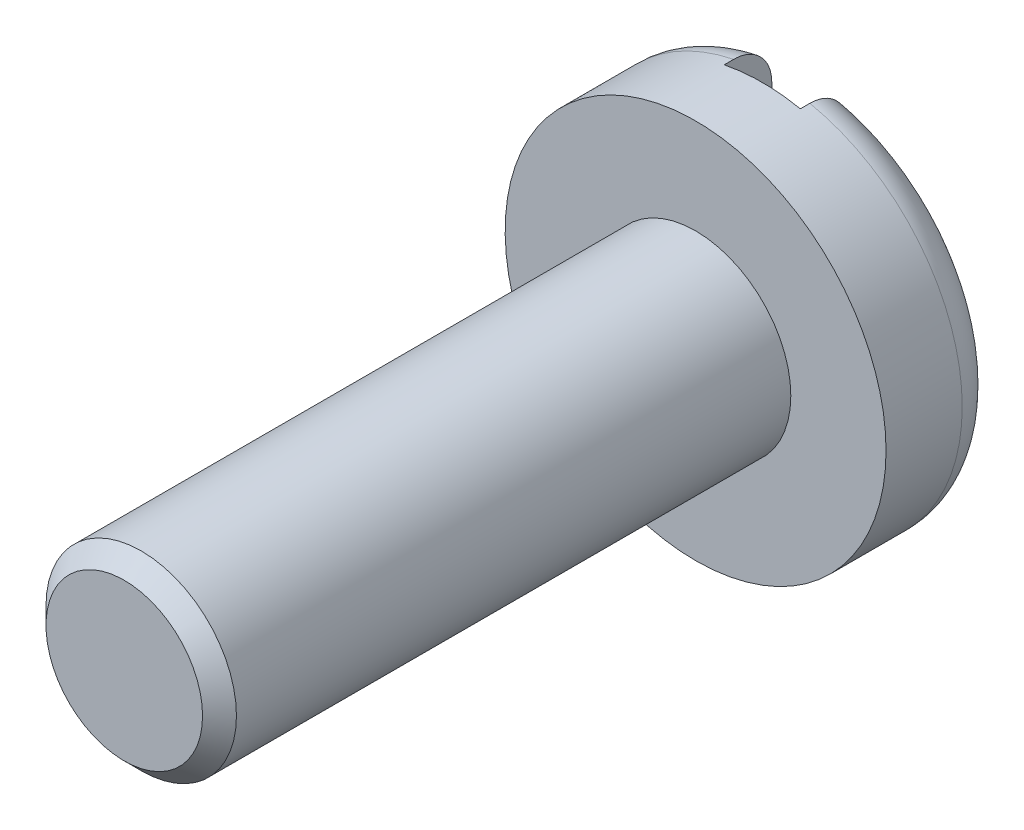
ISO-10303-21;
HEADER;
FILE_DESCRIPTION(('STEP AP214'),'2;1');
FILE_NAME('part.step','',(''),(''),'','','');
FILE_SCHEMA(('AUTOMOTIVE_DESIGN { 1 0 10303 214 1 1 1 1 }'));
ENDSEC;
DATA;
#1=APPLICATION_CONTEXT('core data for automotive mechanical design processes');
#2=APPLICATION_PROTOCOL_DEFINITION('international standard','automotive_design',2000,#1);
#3=PRODUCT_CONTEXT('',#1,'mechanical');
#4=PRODUCT('Part','Part','',(#3));
#5=PRODUCT_RELATED_PRODUCT_CATEGORY('part','',(#4));
#6=PRODUCT_DEFINITION_FORMATION('','',#4);
#7=PRODUCT_DEFINITION_CONTEXT('part definition',#1,'design');
#8=PRODUCT_DEFINITION('design','',#6,#7);
#9=PRODUCT_DEFINITION_SHAPE('','',#8);
#10=(LENGTH_UNIT() NAMED_UNIT(*) SI_UNIT(.MILLI.,.METRE.));
#11=(NAMED_UNIT(*) PLANE_ANGLE_UNIT() SI_UNIT($,.RADIAN.));
#12=(NAMED_UNIT(*) SI_UNIT($,.STERADIAN.) SOLID_ANGLE_UNIT());
#13=UNCERTAINTY_MEASURE_WITH_UNIT(LENGTH_MEASURE(1.E-05),#10,'distance_accuracy_value','');
#14=(GEOMETRIC_REPRESENTATION_CONTEXT(3) GLOBAL_UNCERTAINTY_ASSIGNED_CONTEXT((#13)) GLOBAL_UNIT_ASSIGNED_CONTEXT((#10,
#11,#12)) REPRESENTATION_CONTEXT('',''));
#15=CARTESIAN_POINT('',(0.,0.,0.));
#16=DIRECTION('',(0.,0.,1.));
#17=DIRECTION('',(1.,0.,0.));
#18=AXIS2_PLACEMENT_3D('',#15,#16,#17);
#19=CARTESIAN_POINT('',(0.,0.,0.));
#20=DIRECTION('',(0.,0.,1.));
#21=DIRECTION('',(1.,0.,0.));
#22=AXIS2_PLACEMENT_3D('',#19,#20,#21);
#23=PLANE('',#22);
#24=CARTESIAN_POINT('',(0.,0.,0.));
#25=DIRECTION('',(0.,0.,1.));
#26=DIRECTION('',(1.,0.,0.));
#27=AXIS2_PLACEMENT_3D('',#24,#25,#26);
#28=CIRCLE('',#27,4.);
#29=CARTESIAN_POINT('',(0.999999999999999,3.87298334620742,0.));
#30=VERTEX_POINT('',#29);
#31=CARTESIAN_POINT('',(0.999999999999999,-3.87298334620742,0.));
#32=VERTEX_POINT('',#31);
#33=EDGE_CURVE('E145',#30,#32,#28,.F.);
#34=ORIENTED_EDGE('',*,*,#33,.T.);
#35=DIRECTION('',(0.,1.,0.));
#36=VECTOR('',#35,1.);
#37=CARTESIAN_POINT('',(0.999999999999999,0.,0.));
#38=LINE('',#37,#36);
#39=EDGE_CURVE('E125',#32,#30,#38,.T.);
#40=ORIENTED_EDGE('',*,*,#39,.T.);
#41=EDGE_LOOP('',(#34,#40));
#42=FACE_BOUND('',#41,.T.);
#43=ADVANCED_FACE('F48',(#42),#23,.F.);
#44=CARTESIAN_POINT('',(0.,0.,1.));
#45=DIRECTION('',(0.,0.,1.));
#46=DIRECTION('',(1.,0.,0.));
#47=AXIS2_PLACEMENT_3D('',#44,#45,#46);
#48=TOROIDAL_SURFACE('',#47,4.,1.);
#49=CARTESIAN_POINT('',(0.999999999999999,-4.74089824241527,0.465574839603772));
#50=CARTESIAN_POINT('',(0.999999999999999,-4.77093906909583,0.51206702701001));
#51=CARTESIAN_POINT('',(0.999999999999999,-4.79711067903708,0.561102678447099));
#52=CARTESIAN_POINT('',(0.999999999999999,-4.84088596369063,0.662903994052508));
#53=CARTESIAN_POINT('',(0.999999999999999,-4.85848090806454,0.715673396580716));
#54=CARTESIAN_POINT('',(0.999999999999999,-4.88452978672489,0.823425083640973));
#55=CARTESIAN_POINT('',(0.999999999999999,-4.89298429664504,0.878407228595754));
#56=CARTESIAN_POINT('',(0.999999999999999,-4.90048364927595,0.988997037272202));
#57=CARTESIAN_POINT('',(0.999999999999999,-4.89953057800942,1.04460455959217));
#58=CARTESIAN_POINT('',(0.999999999999999,-4.8882807868657,1.15457059010988));
#59=CARTESIAN_POINT('',(0.999999999999999,-4.87803296373552,1.20893410986675));
#60=CARTESIAN_POINT('',(0.999999999999999,-4.84857983220366,1.31517705937444));
#61=CARTESIAN_POINT('',(0.999999999999999,-4.82937429620127,1.36705642597011));
#62=CARTESIAN_POINT('',(0.999999999999999,-4.78252772145242,1.46703140391835));
#63=CARTESIAN_POINT('',(0.999999999999999,-4.75486299230309,1.51511590558171));
#64=CARTESIAN_POINT('',(0.999999999999999,-4.69195239006159,1.60603553891727));
#65=CARTESIAN_POINT('',(0.999999999999999,-4.65670616379822,1.64887042589909));
#66=CARTESIAN_POINT('',(0.999999999999999,-4.57915929563324,1.72869929202435));
#67=CARTESIAN_POINT('',(0.999999999999999,-4.53677184786283,1.76560890237427));
#68=CARTESIAN_POINT('',(0.999999999999999,-4.44651378239344,1.83196438442698));
#69=CARTESIAN_POINT('',(0.999999999999999,-4.39864266087568,1.86140956952736));
#70=CARTESIAN_POINT('',(0.999999999999999,-4.29768563805518,1.912690559155));
#71=CARTESIAN_POINT('',(0.999999999999999,-4.24450972565911,1.93434908978383));
#72=CARTESIAN_POINT('',(0.999999999999999,-4.13533439460451,1.9686802440512));
#73=CARTESIAN_POINT('',(0.999999999999999,-4.07933461458573,1.98135171450631));
#74=CARTESIAN_POINT('',(0.999999999999999,-3.96457125808458,1.99768568641191));
#75=CARTESIAN_POINT('',(0.999999999999999,-3.90577363084606,2.00110903084919));
#76=CARTESIAN_POINT('',(0.999999999999999,-3.7884126545839,1.99826272601387));
#77=CARTESIAN_POINT('',(0.999999999999999,-3.72984933879538,1.99199174736522));
#78=CARTESIAN_POINT('',(0.999999999999999,-3.613268213964,1.96973618215348));
#79=CARTESIAN_POINT('',(0.999999999999999,-3.55529023657486,1.95354249044896));
#80=CARTESIAN_POINT('',(0.999999999999999,-3.44284084653008,1.91171023463247));
#81=CARTESIAN_POINT('',(0.999999999999999,-3.3883697828002,1.88607073239592));
#82=CARTESIAN_POINT('',(0.999999999999999,-3.28422225313787,1.82582762001542));
#83=CARTESIAN_POINT('',(0.999999999999999,-3.23457377181124,1.79117553669055));
#84=CARTESIAN_POINT('',(0.999999999999999,-3.14196876384408,1.713842252289));
#85=CARTESIAN_POINT('',(0.999999999999999,-3.09901174044189,1.67116164775493));
#86=CARTESIAN_POINT('',(0.999999999999999,-3.02220775407859,1.57998462898422));
#87=CARTESIAN_POINT('',(0.999999999999999,-2.98816883517039,1.5316502178449));
#88=CARTESIAN_POINT('',(0.999999999999999,-2.92919030253011,1.42971369977196));
#89=CARTESIAN_POINT('',(0.999999999999999,-2.90424742518487,1.37611349095908));
#90=CARTESIAN_POINT('',(0.999999999999999,-2.86551921866192,1.26804050353771));
#91=CARTESIAN_POINT('',(0.999999999999999,-2.85123849388488,1.21374526430384));
#92=CARTESIAN_POINT('',(0.999999999999999,-2.83246484792931,1.10349241104978));
#93=CARTESIAN_POINT('',(0.999999999999999,-2.82796880646208,1.04753533275381));
#94=CARTESIAN_POINT('',(0.999999999999999,-2.82893812506757,0.938164760828636));
#95=CARTESIAN_POINT('',(0.999999999999999,-2.83397680054707,0.884746962771905));
#96=CARTESIAN_POINT('',(0.999999999999999,-2.85296958556056,0.779526155630884));
#97=CARTESIAN_POINT('',(0.999999999999999,-2.86692347355491,0.727723106454245));
#98=CARTESIAN_POINT('',(0.999999999999999,-2.90317707406975,0.62720283956641));
#99=CARTESIAN_POINT('',(0.999999999999999,-2.92546742088583,0.578482230394738));
#100=CARTESIAN_POINT('',(0.999999999999999,-2.97760125095634,0.48527139927532));
#101=CARTESIAN_POINT('',(0.999999999999999,-3.00744601755024,0.440781897873544));
#102=CARTESIAN_POINT('',(0.999999999999999,-3.07509259167329,0.355344003704822));
#103=CARTESIAN_POINT('',(0.999999999999999,-3.11316807971552,0.314612481499972));
#104=CARTESIAN_POINT('',(0.999999999999999,-3.19532329186127,0.239740162341416));
#105=CARTESIAN_POINT('',(0.999999999999999,-3.2394044723506,0.20560096890261));
#106=CARTESIAN_POINT('',(0.999999999999999,-3.33470723090834,0.14311767029961));
#107=CARTESIAN_POINT('',(0.999999999999999,-3.38617614939443,0.115150438677534));
#108=CARTESIAN_POINT('',(0.999999999999999,-3.49297945352584,0.067959175273789));
#109=CARTESIAN_POINT('',(0.999999999999999,-3.54831453265273,0.0487367167295342));
#110=CARTESIAN_POINT('',(0.999999999999999,-3.66307362701856,0.0190822643418154));
#111=CARTESIAN_POINT('',(0.999999999999999,-3.72257051102004,0.00893131376428614));
#112=CARTESIAN_POINT('',(0.999999999999999,-3.84242579673291,-0.00125217946359011));
#113=CARTESIAN_POINT('',(0.999999999999999,-3.9027841982355,-0.00128472456621288));
#114=CARTESIAN_POINT('',(0.999999999999999,-4.02269182420806,0.00886219487331795));
#115=CARTESIAN_POINT('',(0.999999999999999,-4.08224035665226,0.0190498972791512));
#116=CARTESIAN_POINT('',(0.999999999999999,-4.19873146910034,0.0494817630717065));
#117=CARTESIAN_POINT('',(0.999999999999999,-4.2556736198033,0.06972757668119));
#118=CARTESIAN_POINT('',(0.999999999999999,-4.36414281303408,0.119321779303109));
#119=CARTESIAN_POINT('',(0.999999999999999,-4.41575180574797,0.148491064083182));
#120=CARTESIAN_POINT('',(0.999999999999999,-4.51311238926742,0.215283374984294));
#121=CARTESIAN_POINT('',(0.999999999999999,-4.55887194720193,0.252894705974579));
#122=CARTESIAN_POINT('',(0.999999999999999,-4.62736160475528,0.320058094017716));
#123=CARTESIAN_POINT('',(0.999999999999999,-4.65231431127167,0.347381814065032));
#124=CARTESIAN_POINT('',(0.999999999999999,-4.69905249332747,0.404617283436022));
#125=CARTESIAN_POINT('',(0.999999999999999,-4.72083802931435,0.43452898334908));
#126=CARTESIAN_POINT('',(0.999999999999999,-4.74089824241527,0.465574839603772));
#127=B_SPLINE_CURVE_WITH_KNOTS('',3,(#49,#50,#51,#52,#53,#54,#55,#56,#57,#58,#59,#60,#61,#62,
#63,#64,#65,#66,#67,#68,#69,#70,#71,#72,#73,#74,#75,#76,#77,#78,#79,#80,#81,#82,#83,#84,#85,#86,
#87,#88,#89,#90,#91,#92,#93,#94,#95,#96,#97,#98,#99,#100,#101,#102,#103,#104,#105,#106,#107,
#108,#109,#110,#111,#112,#113,#114,#115,#116,#117,#118,#119,#120,#121,#122,#123,#124,#125,#126),
.UNSPECIFIED.,.T.,.F.,(4,2,2,2,2,2,2,2,2,2,2,2,2,2,2,2,2,2,2,2,2,2,2,2,2,2,2,2,2,2,2,2,2,2,2,2,
2,2,4),(0.,0.165926564922769,0.332021678524293,0.498106331406758,0.664154157758893,
0.82933349370127,0.99451702680665,1.16016746881096,1.32582562903247,1.49366584887353,
1.66152150161308,1.83298720789472,2.00447491198791,2.18035666144788,2.35626253159434,
2.53600927491765,2.71577387486801,2.89652606583042,3.07726483167773,3.25371559012487,
3.43010297650855,3.59767353069205,3.76519063959225,3.92538799679189,4.08558137330303,
4.24559531645792,4.4056364609326,4.57217005850703,4.73874411274949,4.91367888365498,
5.08864511394687,5.26886084338837,5.44907652915315,5.62943759163489,5.80982825552668,
5.98681257878127,6.16355321494239,6.27435528518346,6.38515524041929),.UNSPECIFIED.);
#128=CARTESIAN_POINT('',(0.999999999999999,-4.89897948556991,1.00000000000064));
#129=VERTEX_POINT('',#128);
#130=EDGE_CURVE('E71',#32,#129,#127,.T.);
#131=ORIENTED_EDGE('',*,*,#130,.F.);
#132=ORIENTED_EDGE('',*,*,#33,.F.);
#133=CARTESIAN_POINT('',(0.999999999999999,2.93448378201662,0.563712357526974));
#134=CARTESIAN_POINT('',(0.999999999999999,2.91000701437085,0.611499699521355));
#135=CARTESIAN_POINT('',(0.999999999999999,2.88943587962965,0.6613192730997));
#136=CARTESIAN_POINT('',(0.999999999999999,2.85688814196943,0.763723114899403));
#137=CARTESIAN_POINT('',(0.999999999999999,2.84491671737472,0.816309028458516));
#138=CARTESIAN_POINT('',(0.999999999999999,2.83006066246026,0.922795059019514));
#139=CARTESIAN_POINT('',(0.999999999999999,2.8271824011816,0.976696070526368));
#140=CARTESIAN_POINT('',(0.999999999999999,2.83065505942636,1.08418986718175));
#141=CARTESIAN_POINT('',(0.999999999999999,2.83700451025153,1.13778270001759));
#142=CARTESIAN_POINT('',(0.999999999999999,2.85852543868406,1.24245417700771));
#143=CARTESIAN_POINT('',(0.999999999999999,2.8735849842021,1.29355596125553));
#144=CARTESIAN_POINT('',(0.999999999999999,2.91186043406805,1.39260230094927));
#145=CARTESIAN_POINT('',(0.999999999999999,2.9350773879355,1.44054644919567));
#146=CARTESIAN_POINT('',(0.999999999999999,2.98954837233285,1.53327223532849));
#147=CARTESIAN_POINT('',(0.999999999999999,3.02099187004184,1.57794236544402));
#148=CARTESIAN_POINT('',(0.999999999999999,3.09059404945473,1.66169746070875));
#149=CARTESIAN_POINT('',(0.999999999999999,3.12875423522928,1.70078117132914));
#150=CARTESIAN_POINT('',(0.999999999999999,3.21277099287321,1.77433657186925));
#151=CARTESIAN_POINT('',(0.999999999999999,3.2589190193294,1.80847544727498));
#152=CARTESIAN_POINT('',(0.999999999999999,3.35610501682304,1.86888755559914));
#153=CARTESIAN_POINT('',(0.999999999999999,3.40714406002746,1.89515905866895));
#154=CARTESIAN_POINT('',(0.999999999999999,3.51493663860159,1.94014213110062));
#155=CARTESIAN_POINT('',(0.999999999999999,3.57183891728481,1.95849801050286));
#156=CARTESIAN_POINT('',(0.999999999999999,3.68790012564205,1.98553945172235));
#157=CARTESIAN_POINT('',(0.999999999999999,3.74705928539265,1.9942240248639));
#158=CARTESIAN_POINT('',(0.999999999999999,3.86678683058724,2.00168514622703));
#159=CARTESIAN_POINT('',(0.999999999999999,3.92736351989617,2.00033007593359));
#160=CARTESIAN_POINT('',(0.999999999999999,4.04740864296231,1.98733987818855));
#161=CARTESIAN_POINT('',(0.999999999999999,4.1068771216297,1.97570516824781));
#162=CARTESIAN_POINT('',(0.999999999999999,4.22221655126588,1.94257877793046));
#163=CARTESIAN_POINT('',(0.999999999999999,4.27812271037955,1.92120988736992));
#164=CARTESIAN_POINT('',(0.999999999999999,4.38541897852354,1.86915599333329));
#165=CARTESIAN_POINT('',(0.999999999999999,4.4368096636758,1.83847218056493));
#166=CARTESIAN_POINT('',(0.999999999999999,4.53224912640572,1.76946640841065));
#167=CARTESIAN_POINT('',(0.999999999999999,4.57644808583963,1.73135219282969));
#168=CARTESIAN_POINT('',(0.999999999999999,4.65761246935788,1.64807163286058));
#169=CARTESIAN_POINT('',(0.999999999999999,4.6945789373752,1.60290630791939));
#170=CARTESIAN_POINT('',(0.999999999999999,4.75925187875461,1.50803971995027));
#171=CARTESIAN_POINT('',(0.999999999999999,4.78716840035085,1.45848160238852));
#172=CARTESIAN_POINT('',(0.999999999999999,4.83410331130973,1.35531690108024));
#173=CARTESIAN_POINT('',(0.999999999999999,4.85312271695606,1.30171078053451));
#174=CARTESIAN_POINT('',(0.999999999999999,4.8813849843533,1.19304353133181));
#175=CARTESIAN_POINT('',(0.999999999999999,4.89080246246899,1.13802776548886));
#176=CARTESIAN_POINT('',(0.999999999999999,4.90017893436993,1.02719713356779));
#177=CARTESIAN_POINT('',(0.999999999999999,4.90013853070775,0.971382318622866));
#178=CARTESIAN_POINT('',(0.999999999999999,4.89064282976504,0.861044631943875));
#179=CARTESIAN_POINT('',(0.999999999999999,4.88126827618146,0.806514785610181));
#180=CARTESIAN_POINT('',(0.999999999999999,4.85351703323853,0.699798298175667));
#181=CARTESIAN_POINT('',(0.999999999999999,4.83514041102996,0.647611639599051));
#182=CARTESIAN_POINT('',(0.999999999999999,4.7898963484848,0.546916340672522));
#183=CARTESIAN_POINT('',(0.999999999999999,4.76300931062551,0.49841651315801));
#184=CARTESIAN_POINT('',(0.999999999999999,4.70157102231077,0.40654588758618));
#185=CARTESIAN_POINT('',(0.999999999999999,4.66701943196387,0.363175317121159));
#186=CARTESIAN_POINT('',(0.999999999999999,4.59078648763996,0.28218375551089));
#187=CARTESIAN_POINT('',(0.999999999999999,4.54902009139599,0.244642852795113));
#188=CARTESIAN_POINT('',(0.999999999999999,4.45989016824042,0.176933955502939));
#189=CARTESIAN_POINT('',(0.999999999999999,4.41252611929278,0.146766649393012));
#190=CARTESIAN_POINT('',(0.999999999999999,4.31248365666993,0.0939644367849335));
#191=CARTESIAN_POINT('',(0.999999999999999,4.25971392738017,0.0715026113786261));
#192=CARTESIAN_POINT('',(0.999999999999999,4.15121403498489,0.0355099340098975));
#193=CARTESIAN_POINT('',(0.999999999999999,4.09548349400933,0.0219802249708486));
#194=CARTESIAN_POINT('',(0.999999999999999,3.98112357390738,0.00387475366064818));
#195=CARTESIAN_POINT('',(0.999999999999999,3.92245650859443,-0.00046302607484398));
#196=CARTESIAN_POINT('',(0.999999999999999,3.80520680768677,0.000541534748304016));
#197=CARTESIAN_POINT('',(0.999999999999999,3.74662418118805,0.0058848500380907));
#198=CARTESIAN_POINT('',(0.999999999999999,3.62983062174308,0.0262748614280143));
#199=CARTESIAN_POINT('',(0.999999999999999,3.57165669553844,0.0415339672258737));
#200=CARTESIAN_POINT('',(0.999999999999999,3.45864282796451,0.0815371173671725));
#201=CARTESIAN_POINT('',(0.999999999999999,3.40380404058364,0.106284423323527));
#202=CARTESIAN_POINT('',(0.999999999999999,3.29868362289936,0.164838892815233));
#203=CARTESIAN_POINT('',(0.999999999999999,3.24843699896355,0.198708947931725));
#204=CARTESIAN_POINT('',(0.999999999999999,3.15454628236655,0.274557510454423));
#205=CARTESIAN_POINT('',(0.999999999999999,3.11089402089954,0.316525836770678));
#206=CARTESIAN_POINT('',(0.999999999999999,3.04452347002882,0.392684680073623));
#207=CARTESIAN_POINT('',(0.999999999999999,3.0196067387943,0.424984987907534));
#208=CARTESIAN_POINT('',(0.999999999999999,2.97387209493399,0.492371194850656));
#209=CARTESIAN_POINT('',(0.999999999999999,2.95305389666677,0.527456899596257));
#210=CARTESIAN_POINT('',(0.999999999999999,2.93448378201662,0.563712357526974));
#211=B_SPLINE_CURVE_WITH_KNOTS('',3,(#133,#134,#135,#136,#137,#138,#139,#140,#141,#142,#143,
#144,#145,#146,#147,#148,#149,#150,#151,#152,#153,#154,#155,#156,#157,#158,#159,#160,#161,#162,
#163,#164,#165,#166,#167,#168,#169,#170,#171,#172,#173,#174,#175,#176,#177,#178,#179,#180,#181,
#182,#183,#184,#185,#186,#187,#188,#189,#190,#191,#192,#193,#194,#195,#196,#197,#198,#199,#200,
#201,#202,#203,#204,#205,#206,#207,#208,#209,#210),.UNSPECIFIED.,.T.,.F.,(4,2,2,2,2,2,2,2,2,2,2,
2,2,2,2,2,2,2,2,2,2,2,2,2,2,2,2,2,2,2,2,2,2,2,2,2,2,2,4),(0.,0.160932429040886,
0.321961682664087,0.483103699555348,0.644220071619469,0.803310565674792,0.962421535566603,
1.12558098044401,1.28877700827265,1.46021890091361,1.63169846193065,1.81023639217772,
1.98879257227755,2.1696937050775,2.3505874908574,2.5292600485585,2.70790977651708,
2.88213979820068,3.05634465305619,3.22615550479707,3.39594695495147,3.56259240299338,
3.72922723421693,3.89443302994594,4.05963759334406,4.22522538681189,4.39082052488689,
4.55852049840211,4.72623612394564,4.89750419570732,5.06879417810633,5.24446731371527,
5.42015813777703,5.59974239479571,5.77938844016696,5.96030613785517,6.14099785176801,
6.26310310975783,6.38519985478011),.UNSPECIFIED.);
#212=CARTESIAN_POINT('',(0.999999999999999,4.898979485567,0.99999999999989));
#213=VERTEX_POINT('',#212);
#214=EDGE_CURVE('E173',#213,#30,#211,.T.);
#215=ORIENTED_EDGE('',*,*,#214,.F.);
#216=CARTESIAN_POINT('',(0.,0.,1.));
#217=DIRECTION('',(0.,0.,1.));
#218=DIRECTION('',(1.,0.,0.));
#219=AXIS2_PLACEMENT_3D('',#216,#217,#218);
#220=CIRCLE('',#219,5.);
#221=EDGE_CURVE('E143',#129,#213,#220,.T.);
#222=ORIENTED_EDGE('',*,*,#221,.F.);
#223=EDGE_LOOP('',(#131,#132,#215,#222));
#224=FACE_BOUND('',#223,.T.);
#225=ADVANCED_FACE('F189',(#224),#48,.T.);
#226=CARTESIAN_POINT('',(0.,0.,3.));
#227=DIRECTION('',(0.,0.,1.));
#228=DIRECTION('',(1.,0.,0.));
#229=AXIS2_PLACEMENT_3D('',#226,#227,#228);
#230=PLANE('',#229);
#231=CARTESIAN_POINT('',(0.,0.,3.));
#232=DIRECTION('',(0.,0.,1.));
#233=DIRECTION('',(1.,0.,0.));
#234=AXIS2_PLACEMENT_3D('',#231,#232,#233);
#235=CIRCLE('',#234,5.);
#236=CARTESIAN_POINT('',(5.,0.,3.));
#237=VERTEX_POINT('',#236);
#238=EDGE_CURVE('E140',#237,#237,#235,.T.);
#239=ORIENTED_EDGE('',*,*,#238,.T.);
#240=EDGE_LOOP('',(#239));
#241=FACE_BOUND('',#240,.T.);
#242=CARTESIAN_POINT('',(0.,0.,3.));
#243=DIRECTION('',(0.,0.,1.));
#244=DIRECTION('',(1.,0.,0.));
#245=AXIS2_PLACEMENT_3D('',#242,#243,#244);
#246=CIRCLE('',#245,2.5);
#247=CARTESIAN_POINT('',(2.5,0.,3.));
#248=VERTEX_POINT('',#247);
#249=EDGE_CURVE('E137',#248,#248,#246,.T.);
#250=ORIENTED_EDGE('',*,*,#249,.F.);
#251=EDGE_LOOP('',(#250));
#252=FACE_BOUND('',#251,.T.);
#253=ADVANCED_FACE('F196',(#241,#252),#230,.T.);
#254=CARTESIAN_POINT('',(0.,0.,3.));
#255=DIRECTION('',(0.,0.,-1.));
#256=DIRECTION('',(-1.,0.,0.));
#257=AXIS2_PLACEMENT_3D('',#254,#255,#256);
#258=CYLINDRICAL_SURFACE('',#257,5.);
#259=ORIENTED_EDGE('',*,*,#221,.T.);
#260=DIRECTION('',(0.,0.,-1.));
#261=VECTOR('',#260,1.);
#262=CARTESIAN_POINT('',(0.999999999999999,4.89897948556636,3.));
#263=LINE('',#262,#261);
#264=CARTESIAN_POINT('',(0.999999999999999,4.89897948556636,1.25));
#265=VERTEX_POINT('',#264);
#266=EDGE_CURVE('E128',#213,#265,#263,.F.);
#267=ORIENTED_EDGE('',*,*,#266,.T.);
#268=CARTESIAN_POINT('',(0.,0.,1.25));
#269=DIRECTION('',(0.,0.,1.));
#270=DIRECTION('',(1.,0.,0.));
#271=AXIS2_PLACEMENT_3D('',#268,#269,#270);
#272=CIRCLE('',#271,5.);
#273=CARTESIAN_POINT('',(-1.,4.89897948556636,1.25));
#274=VERTEX_POINT('',#273);
#275=EDGE_CURVE('E111',#265,#274,#272,.T.);
#276=ORIENTED_EDGE('',*,*,#275,.T.);
#277=DIRECTION('',(0.,0.,-1.));
#278=VECTOR('',#277,1.);
#279=CARTESIAN_POINT('',(-1.,4.89897948556636,3.));
#280=LINE('',#279,#278);
#281=CARTESIAN_POINT('',(-1.,4.89897948556636,1.));
#282=VERTEX_POINT('',#281);
#283=EDGE_CURVE('E117',#274,#282,#280,.T.);
#284=ORIENTED_EDGE('',*,*,#283,.T.);
#285=CARTESIAN_POINT('',(-1.,-4.89897948556636,1.));
#286=VERTEX_POINT('',#285);
#287=EDGE_CURVE('E124',#282,#286,#220,.T.);
#288=ORIENTED_EDGE('',*,*,#287,.T.);
#289=DIRECTION('',(0.,0.,-1.));
#290=VECTOR('',#289,1.);
#291=CARTESIAN_POINT('',(-1.,-4.89897948556636,3.));
#292=LINE('',#291,#290);
#293=CARTESIAN_POINT('',(-1.,-4.89897948556636,1.25));
#294=VERTEX_POINT('',#293);
#295=EDGE_CURVE('E114',#286,#294,#292,.F.);
#296=ORIENTED_EDGE('',*,*,#295,.T.);
#297=CARTESIAN_POINT('',(0.999999999999999,-4.89897948556636,1.25));
#298=VERTEX_POINT('',#297);
#299=EDGE_CURVE('E102',#294,#298,#272,.T.);
#300=ORIENTED_EDGE('',*,*,#299,.T.);
#301=DIRECTION('',(0.,0.,-1.));
#302=VECTOR('',#301,1.);
#303=CARTESIAN_POINT('',(0.999999999999999,-4.89897948556636,3.));
#304=LINE('',#303,#302);
#305=EDGE_CURVE('E135',#298,#129,#304,.T.);
#306=ORIENTED_EDGE('',*,*,#305,.T.);
#307=EDGE_LOOP('',(#259,#267,#276,#284,#288,#296,#300,#306));
#308=FACE_BOUND('',#307,.T.);
#309=ORIENTED_EDGE('',*,*,#238,.F.);
#310=EDGE_LOOP('',(#309));
#311=FACE_BOUND('',#310,.T.);
#312=ADVANCED_FACE('F121',(#308,#311),#258,.T.);
#313=CARTESIAN_POINT('',(-1.,-3.87298334620742,0.));
#314=VERTEX_POINT('',#313);
#315=CARTESIAN_POINT('',(-1.,3.87298334620742,0.));
#316=VERTEX_POINT('',#315);
#317=EDGE_CURVE('E148',#314,#316,#28,.F.);
#318=ORIENTED_EDGE('',*,*,#317,.T.);
#319=DIRECTION('',(0.,-1.,0.));
#320=VECTOR('',#319,1.);
#321=CARTESIAN_POINT('',(-1.,0.,0.));
#322=LINE('',#321,#320);
#323=EDGE_CURVE('E63',#316,#314,#322,.T.);
#324=ORIENTED_EDGE('',*,*,#323,.T.);
#325=EDGE_LOOP('',(#318,#324));
#326=FACE_BOUND('',#325,.T.);
#327=ADVANCED_FACE('F192',(#326),#23,.F.);
#328=CARTESIAN_POINT('',(0.,0.,18.));
#329=DIRECTION('',(0.,0.,-1.));
#330=DIRECTION('',(-1.,0.,0.));
#331=AXIS2_PLACEMENT_3D('',#328,#329,#330);
#332=CYLINDRICAL_SURFACE('',#331,2.5);
#333=CARTESIAN_POINT('',(0.,0.,17.555));
#334=DIRECTION('',(0.,0.,1.));
#335=DIRECTION('',(1.,0.,0.));
#336=AXIS2_PLACEMENT_3D('',#333,#334,#335);
#337=CIRCLE('',#336,2.5);
#338=CARTESIAN_POINT('',(2.5,0.,17.555));
#339=VERTEX_POINT('',#338);
#340=EDGE_CURVE('E13',#339,#339,#337,.F.);
#341=ORIENTED_EDGE('',*,*,#340,.T.);
#342=EDGE_LOOP('',(#341));
#343=FACE_BOUND('',#342,.T.);
#344=ORIENTED_EDGE('',*,*,#249,.T.);
#345=EDGE_LOOP('',(#344));
#346=FACE_BOUND('',#345,.T.);
#347=ADVANCED_FACE('F200',(#343,#346),#332,.T.);
#348=CARTESIAN_POINT('',(0.,0.,18.));
#349=DIRECTION('',(0.,0.,1.));
#350=DIRECTION('',(1.,0.,0.));
#351=AXIS2_PLACEMENT_3D('',#348,#349,#350);
#352=PLANE('',#351);
#353=CARTESIAN_POINT('',(0.,0.,18.));
#354=DIRECTION('',(0.,0.,1.));
#355=DIRECTION('',(1.,0.,0.));
#356=AXIS2_PLACEMENT_3D('',#353,#354,#355);
#357=CIRCLE('',#356,2.055);
#358=CARTESIAN_POINT('',(2.055,0.,18.));
#359=VERTEX_POINT('',#358);
#360=EDGE_CURVE('E56',#359,#359,#357,.T.);
#361=ORIENTED_EDGE('',*,*,#360,.T.);
#362=EDGE_LOOP('',(#361));
#363=FACE_BOUND('',#362,.T.);
#364=ADVANCED_FACE('F170',(#363),#352,.T.);
#365=CARTESIAN_POINT('',(-1.,-4.74089824241527,0.465574839603772));
#366=CARTESIAN_POINT('',(-1.,-4.71006504434273,0.417866026271933));
#367=CARTESIAN_POINT('',(-1.,-4.6751098226035,0.372764712432561));
#368=CARTESIAN_POINT('',(-1.,-4.59804874703975,0.289078184737448));
#369=CARTESIAN_POINT('',(-1.,-4.55593263021828,0.25050248394991));
#370=CARTESIAN_POINT('',(-1.,-4.46591301848721,0.180982646947053));
#371=CARTESIAN_POINT('',(-1.,-4.4180181487066,0.150027341766012));
#372=CARTESIAN_POINT('',(-1.,-4.31780290367036,0.0964434922586625));
#373=CARTESIAN_POINT('',(-1.,-4.2654836242965,0.0738128933726713));
#374=CARTESIAN_POINT('',(-1.,-4.15688639062318,0.0370316594163569));
#375=CARTESIAN_POINT('',(-1.,-4.100553824234,0.0230423784679849));
#376=CARTESIAN_POINT('',(-1.,-3.98635779238308,0.00446334406000498));
#377=CARTESIAN_POINT('',(-1.,-3.92849405595542,-0.000124734279878504));
#378=CARTESIAN_POINT('',(-1.,-3.81132325970972,0.000133100803891473));
#379=CARTESIAN_POINT('',(-1.,-3.75201668849146,0.00522041388350425));
#380=CARTESIAN_POINT('',(-1.,-3.63505192016167,0.0251075472722434));
#381=CARTESIAN_POINT('',(-1.,-3.57739393541042,0.0399086130147861));
#382=CARTESIAN_POINT('',(-1.,-3.46437844977045,0.0791376182469322));
#383=CARTESIAN_POINT('',(-1.,-3.40907452030981,0.103720189003618));
#384=CARTESIAN_POINT('',(-1.,-3.30340159450845,0.161871657843278));
#385=CARTESIAN_POINT('',(-1.,-3.25303282340774,0.195440965819089));
#386=CARTESIAN_POINT('',(-1.,-3.15907642237272,0.270496212732381));
#387=CARTESIAN_POINT('',(-1.,-3.11544937211384,0.311932706167295));
#388=CARTESIAN_POINT('',(-1.,-3.03609367279736,0.401791551777657));
#389=CARTESIAN_POINT('',(-1.,-3.00036340723746,0.450212470854058));
#390=CARTESIAN_POINT('',(-1.,-2.93933307883138,0.550779629106609));
#391=CARTESIAN_POINT('',(-1.,-2.91369391724477,0.602719769865144));
#392=CARTESIAN_POINT('',(-1.,-2.87205799589477,0.710329391598537));
#393=CARTESIAN_POINT('',(-1.,-2.85605738212416,0.765997372076681));
#394=CARTESIAN_POINT('',(-1.,-2.83498204409577,0.876325444742326));
#395=CARTESIAN_POINT('',(-1.,-2.82937690102811,0.930884538794629));
#396=CARTESIAN_POINT('',(-1.,-2.82769992394519,1.04014405336782));
#397=CARTESIAN_POINT('',(-1.,-2.83162626017063,1.09484444475006));
#398=CARTESIAN_POINT('',(-1.,-2.84859525920481,1.20123036890537));
#399=CARTESIAN_POINT('',(-1.,-2.86137990625239,1.2529574342043));
#400=CARTESIAN_POINT('',(-1.,-2.89528700569401,1.35359651128066));
#401=CARTESIAN_POINT('',(-1.,-2.91641009833706,1.40250830656333));
#402=CARTESIAN_POINT('',(-1.,-2.9667328689461,1.4972183763948));
#403=CARTESIAN_POINT('',(-1.,-2.99608376853025,1.54293611620848));
#404=CARTESIAN_POINT('',(-1.,-3.06170309398662,1.62909849046292));
#405=CARTESIAN_POINT('',(-1.,-3.09797302420534,1.66954197494133));
#406=CARTESIAN_POINT('',(-1.,-3.17830644447611,1.74612245657385));
#407=CARTESIAN_POINT('',(-1.,-3.2226659592754,1.78194893303855));
#408=CARTESIAN_POINT('',(-1.,-3.31655627768058,1.84602431985042));
#409=CARTESIAN_POINT('',(-1.,-3.36608826160068,1.8742714953924));
#410=CARTESIAN_POINT('',(-1.,-3.47127383748911,1.92361657425344));
#411=CARTESIAN_POINT('',(-1.,-3.52710083359259,1.94434551083178));
#412=CARTESIAN_POINT('',(-1.,-3.64141105479511,1.97631862744627));
#413=CARTESIAN_POINT('',(-1.,-3.6998946016246,1.98756165541496));
#414=CARTESIAN_POINT('',(-1.,-3.81893144312851,2.00033263679753));
#415=CARTESIAN_POINT('',(-1.,-3.87950302789219,2.00169137816073));
#416=CARTESIAN_POINT('',(-1.,-4.00000385585722,1.99412019775753));
#417=CARTESIAN_POINT('',(-1.,-4.05993311497126,1.98519053146902));
#418=CARTESIAN_POINT('',(-1.,-4.17681480607959,1.95731903796157));
#419=CARTESIAN_POINT('',(-1.,-4.23379025683181,1.93847395148709));
#420=CARTESIAN_POINT('',(-1.,-4.34364912247139,1.89125448589588));
#421=CARTESIAN_POINT('',(-1.,-4.39653302124242,1.86288123574483));
#422=CARTESIAN_POINT('',(-1.,-4.49534674402833,1.79812484434942));
#423=CARTESIAN_POINT('',(-1.,-4.54141243920482,1.76194908554623));
#424=CARTESIAN_POINT('',(-1.,-4.62661329720358,1.68219110958364));
#425=CARTESIAN_POINT('',(-1.,-4.66574945575197,1.63860995829406));
#426=CARTESIAN_POINT('',(-1.,-4.7349228851927,1.5464891936478));
#427=CARTESIAN_POINT('',(-1.,-4.76516784088004,1.49810548543352));
#428=CARTESIAN_POINT('',(-1.,-4.81691403011862,1.39687081421513));
#429=CARTESIAN_POINT('',(-1.,-4.8384166751572,1.34402057401933));
#430=CARTESIAN_POINT('',(-1.,-4.87165265434677,1.23648060002816));
#431=CARTESIAN_POINT('',(-1.,-4.8835707874061,1.18184791788991));
#432=CARTESIAN_POINT('',(-1.,-4.89796541764309,1.07133733509905));
#433=CARTESIAN_POINT('',(-1.,-4.90044008644339,1.01545919541594));
#434=CARTESIAN_POINT('',(-1.,-4.89588896522175,0.904630696825418));
#435=CARTESIAN_POINT('',(-1.,-4.88895305291438,0.849676564845942));
#436=CARTESIAN_POINT('',(-1.,-4.86595745745963,0.74176350309161));
#437=CARTESIAN_POINT('',(-1.,-4.84990954904813,0.688802092266979));
#438=CARTESIAN_POINT('',(-1.,-4.81765133809098,0.607554539037998));
#439=CARTESIAN_POINT('',(-1.,-4.80425205205763,0.578120576034035));
#440=CARTESIAN_POINT('',(-1.,-4.77464592147788,0.520701401782338));
#441=CARTESIAN_POINT('',(-1.,-4.75843911229441,0.49271617229244));
#442=CARTESIAN_POINT('',(-1.,-4.74089824241527,0.465574839603772));
#443=B_SPLINE_CURVE_WITH_KNOTS('',3,(#365,#366,#367,#368,#369,#370,#371,#372,#373,#374,#375,
#376,#377,#378,#379,#380,#381,#382,#383,#384,#385,#386,#387,#388,#389,#390,#391,#392,#393,#394,
#395,#396,#397,#398,#399,#400,#401,#402,#403,#404,#405,#406,#407,#408,#409,#410,#411,#412,#413,
#414,#415,#416,#417,#418,#419,#420,#421,#422,#423,#424,#425,#426,#427,#428,#429,#430,#431,#432,
#433,#434,#435,#436,#437,#438,#439,#440,#441,#442),.UNSPECIFIED.,.T.,.F.,(4,2,2,2,2,2,2,2,2,2,2,
2,2,2,2,2,2,2,2,2,2,2,2,2,2,2,2,2,2,2,2,2,2,2,2,2,2,2,4),(0.,0.170293975521392,
0.340834106060492,0.511122773064458,0.68136938412942,0.854705746974298,1.02807299245539,
1.20582253507193,1.38359487201804,1.56429690126109,1.74500717388422,1.92461717711484,
2.10419037936075,2.27707097357381,2.44988239490902,2.61360418079543,2.77729453947537,
2.93640717223626,3.09553202448444,3.25779845849846,3.4201002130282,3.59040174897868,
3.76074223158909,3.9385726074352,4.11642457774518,4.29731423662401,4.47819940381492,
4.65735160743837,4.83648259129972,5.01133733756505,5.18616693799579,5.35651100318811,
5.52682755459428,5.69377572556944,5.86075621823952,6.02615310412188,6.19133674509111,
6.28821745404154,6.38509694279247),.UNSPECIFIED.);
#444=EDGE_CURVE('E154',#286,#314,#443,.T.);
#445=ORIENTED_EDGE('',*,*,#444,.F.);
#446=ORIENTED_EDGE('',*,*,#287,.F.);
#447=CARTESIAN_POINT('',(-1.,2.93448378201662,0.56371235752696));
#448=CARTESIAN_POINT('',(-1.,2.96069908956071,0.512541844199813));
#449=CARTESIAN_POINT('',(-1.,2.99143461862511,0.463625749821992));
#450=CARTESIAN_POINT('',(-1.,3.06079531157116,0.371670420886448));
#451=CARTESIAN_POINT('',(-1.,3.09943509034507,0.328642322758626));
#452=CARTESIAN_POINT('',(-1.,3.18319773931919,0.249679976967479));
#453=CARTESIAN_POINT('',(-1.,3.22830410939954,0.21372821117273));
#454=CARTESIAN_POINT('',(-1.,3.32372370649943,0.149628128185224));
#455=CARTESIAN_POINT('',(-1.,3.37403533766735,0.121477428986453));
#456=CARTESIAN_POINT('',(-1.,3.48026367685224,0.0728033443089894));
#457=CARTESIAN_POINT('',(-1.,3.53631126943571,0.0525652722254238));
#458=CARTESIAN_POINT('',(-1.,3.65098426925227,0.0216085537951601));
#459=CARTESIAN_POINT('',(-1.,3.70961014211835,0.0108916344230947));
#460=CARTESIAN_POINT('',(-1.,3.82880493604301,-0.00078733170479495));
#461=CARTESIAN_POINT('',(-1.,3.88938995532964,-0.00158638430060832));
#462=CARTESIAN_POINT('',(-1.,4.0098215138411,0.00710473460345341));
#463=CARTESIAN_POINT('',(-1.,4.06966807498175,0.0165946000045844));
#464=CARTESIAN_POINT('',(-1.,4.18625445283549,0.045557850031344));
#465=CARTESIAN_POINT('',(-1.,4.24301964658742,0.0649288751755898));
#466=CARTESIAN_POINT('',(-1.,4.35236914421765,0.113158064989272));
#467=CARTESIAN_POINT('',(-1.,4.40495397158308,0.142015039447727));
#468=CARTESIAN_POINT('',(-1.,4.50308682404843,0.207663469722826));
#469=CARTESIAN_POINT('',(-1.,4.54877374634852,0.244247250399062));
#470=CARTESIAN_POINT('',(-1.,4.63315296623722,0.324749201993156));
#471=CARTESIAN_POINT('',(-1.,4.67184626736106,0.368666318886383));
#472=CARTESIAN_POINT('',(-1.,4.74009804769514,0.461370974058742));
#473=CARTESIAN_POINT('',(-1.,4.76986497533992,0.510005092771624));
#474=CARTESIAN_POINT('',(-1.,4.82062279255562,0.611655891079577));
#475=CARTESIAN_POINT('',(-1.,4.84161473007484,0.664672046446099));
#476=CARTESIAN_POINT('',(-1.,4.87382749717557,0.772469080638745));
#477=CARTESIAN_POINT('',(-1.,4.88523031909315,0.827195628337143));
#478=CARTESIAN_POINT('',(-1.,4.89858646288883,0.937788961170139));
#479=CARTESIAN_POINT('',(-1.,4.90054043785865,0.993655667230462));
#480=CARTESIAN_POINT('',(-1.,4.89496542939565,1.10436791911557));
#481=CARTESIAN_POINT('',(-1.,4.88752819543608,1.15921811403541));
#482=CARTESIAN_POINT('',(-1.,4.8635597577315,1.26689203249944));
#483=CARTESIAN_POINT('',(-1.,4.84702867887301,1.3197157838623));
#484=CARTESIAN_POINT('',(-1.,4.80535729828216,1.42192006707087));
#485=CARTESIAN_POINT('',(-1.,4.78020688240256,1.47129647140678));
#486=CARTESIAN_POINT('',(-1.,4.7220644150698,1.56519005706479));
#487=CARTESIAN_POINT('',(-1.,4.68907204933344,1.60970704353077));
#488=CARTESIAN_POINT('',(-1.,4.61579470420978,1.69319534608683));
#489=CARTESIAN_POINT('',(-1.,4.57542903075492,1.73209579822611));
#490=CARTESIAN_POINT('',(-1.,4.48885410382951,1.80272927254914));
#491=CARTESIAN_POINT('',(-1.,4.44264434198905,1.834461670523));
#492=CARTESIAN_POINT('',(-1.,4.3446951889382,1.89056684638817));
#493=CARTESIAN_POINT('',(-1.,4.29286208439692,1.91477595067732));
#494=CARTESIAN_POINT('',(-1.,4.18593682615196,1.95439075932937));
#495=CARTESIAN_POINT('',(-1.,4.13084426980528,1.9697953735495));
#496=CARTESIAN_POINT('',(-1.,4.01747245086688,1.99177646878197));
#497=CARTESIAN_POINT('',(-1.,3.95914779107884,1.99811881708663));
#498=CARTESIAN_POINT('',(-1.,3.84224743021022,2.00116065784692));
#499=CARTESIAN_POINT('',(-1.,3.78367169582827,1.99785882897307));
#500=CARTESIAN_POINT('',(-1.,3.66649665687417,1.98157959721558));
#501=CARTESIAN_POINT('',(-1.,3.60792810098181,1.96838032073936));
#502=CARTESIAN_POINT('',(-1.,3.49379367510806,1.93242992628882));
#503=CARTESIAN_POINT('',(-1.,3.43822814401251,1.90967773281517));
#504=CARTESIAN_POINT('',(-1.,3.33119938447256,1.85495868431804));
#505=CARTESIAN_POINT('',(-1.,3.27977720845297,1.82291137784138));
#506=CARTESIAN_POINT('',(-1.,3.18316541249466,1.75048575915997));
#507=CARTESIAN_POINT('',(-1.,3.13797558898911,1.71010771916887));
#508=CARTESIAN_POINT('',(-1.,3.05612598496546,1.62288795045319));
#509=CARTESIAN_POINT('',(-1.,3.01932190714165,1.57618189858792));
#510=CARTESIAN_POINT('',(-1.,2.95454007779371,1.47700265195269));
#511=CARTESIAN_POINT('',(-1.,2.92655907199995,1.42453159317833));
#512=CARTESIAN_POINT('',(-1.,2.88167927414817,1.3179722125554));
#513=CARTESIAN_POINT('',(-1.,2.86431717887304,1.26407912220534));
#514=CARTESIAN_POINT('',(-1.,2.83939489159018,1.15405860410064));
#515=CARTESIAN_POINT('',(-1.,2.83183396113153,1.09793134500383));
#516=CARTESIAN_POINT('',(-1.,2.82697258396262,0.987894248723951));
#517=CARTESIAN_POINT('',(-1.,2.82920659857394,0.934004177197779));
#518=CARTESIAN_POINT('',(-1.,2.84278988982708,0.827438546894397));
#519=CARTESIAN_POINT('',(-1.,2.85412657859915,0.77476141418579));
#520=CARTESIAN_POINT('',(-1.,2.87814706416014,0.695923528291643));
#521=CARTESIAN_POINT('',(-1.,2.88776979136517,0.668791436536003));
#522=CARTESIAN_POINT('',(-1.,2.90937910122904,0.615488893131905));
#523=CARTESIAN_POINT('',(-1.,2.92136549700588,0.589318365651893));
#524=CARTESIAN_POINT('',(-1.,2.93448378201662,0.56371235752696));
#525=B_SPLINE_CURVE_WITH_KNOTS('',3,(#447,#448,#449,#450,#451,#452,#453,#454,#455,#456,#457,
#458,#459,#460,#461,#462,#463,#464,#465,#466,#467,#468,#469,#470,#471,#472,#473,#474,#475,#476,
#477,#478,#479,#480,#481,#482,#483,#484,#485,#486,#487,#488,#489,#490,#491,#492,#493,#494,#495,
#496,#497,#498,#499,#500,#501,#502,#503,#504,#505,#506,#507,#508,#509,#510,#511,#512,#513,#514,
#515,#516,#517,#518,#519,#520,#521,#522,#523,#524),.UNSPECIFIED.,.T.,.F.,(4,2,2,2,2,2,2,2,2,2,2,
2,2,2,2,2,2,2,2,2,2,2,2,2,2,2,2,2,2,2,2,2,2,2,2,2,2,2,4),(0.,0.172373444393884,
0.345068534386002,0.517330570274521,0.689539948944809,0.867485853892042,1.04546402860421,
1.22636336687485,1.40725732347748,1.58631433376038,1.76534888616161,1.94007458659391,
2.11477519518339,2.28500456623333,2.4552136019234,2.62211424654521,2.78900335505205,
2.95427454695264,3.11954346922707,3.28500699002192,3.45047714324579,3.61788042521346,
3.78529827941156,3.95613787170724,4.12699861221483,4.30219849876801,4.47742239023443,
4.65669634048954,4.83599047941919,5.01688528545629,5.1977741815411,5.37526489802213,
5.55269007269335,5.72168691530388,5.89067102441494,6.05171291512221,6.21253248762318,
6.29879593101046,6.38505255676393),.UNSPECIFIED.);
#526=EDGE_CURVE('E149',#316,#282,#525,.T.);
#527=ORIENTED_EDGE('',*,*,#526,.F.);
#528=ORIENTED_EDGE('',*,*,#317,.F.);
#529=EDGE_LOOP('',(#445,#446,#527,#528));
#530=FACE_BOUND('',#529,.T.);
#531=ADVANCED_FACE('F158',(#530),#48,.T.);
#532=CARTESIAN_POINT('',(-1.,-5.,1.25));
#533=DIRECTION('',(0.,0.,1.));
#534=DIRECTION('',(1.,0.,0.));
#535=AXIS2_PLACEMENT_3D('',#532,#533,#534);
#536=PLANE('',#535);
#537=DIRECTION('',(0.,1.,0.));
#538=VECTOR('',#537,1.);
#539=CARTESIAN_POINT('',(0.999999999999999,-5.,1.25));
#540=LINE('',#539,#538);
#541=EDGE_CURVE('E108',#298,#265,#540,.T.);
#542=ORIENTED_EDGE('',*,*,#541,.F.);
#543=ORIENTED_EDGE('',*,*,#299,.F.);
#544=DIRECTION('',(0.,1.,0.));
#545=VECTOR('',#544,1.);
#546=CARTESIAN_POINT('',(-1.,-5.,1.25));
#547=LINE('',#546,#545);
#548=EDGE_CURVE('E105',#294,#274,#547,.T.);
#549=ORIENTED_EDGE('',*,*,#548,.T.);
#550=ORIENTED_EDGE('',*,*,#275,.F.);
#551=EDGE_LOOP('',(#542,#543,#549,#550));
#552=FACE_BOUND('',#551,.T.);
#553=ADVANCED_FACE('F104',(#552),#536,.F.);
#554=CARTESIAN_POINT('',(0.999999999999999,-5.,1.25));
#555=DIRECTION('',(1.,0.,0.));
#556=DIRECTION('',(0.,0.,-1.));
#557=AXIS2_PLACEMENT_3D('',#554,#555,#556);
#558=PLANE('',#557);
#559=ORIENTED_EDGE('',*,*,#541,.T.);
#560=ORIENTED_EDGE('',*,*,#266,.F.);
#561=ORIENTED_EDGE('',*,*,#214,.T.);
#562=ORIENTED_EDGE('',*,*,#39,.F.);
#563=ORIENTED_EDGE('',*,*,#130,.T.);
#564=ORIENTED_EDGE('',*,*,#305,.F.);
#565=EDGE_LOOP('',(#559,#560,#561,#562,#563,#564));
#566=FACE_BOUND('',#565,.T.);
#567=ADVANCED_FACE('F165',(#566),#558,.F.);
#568=CARTESIAN_POINT('',(-1.,-5.,1.25));
#569=DIRECTION('',(-1.,0.,0.));
#570=DIRECTION('',(0.,0.,1.));
#571=AXIS2_PLACEMENT_3D('',#568,#569,#570);
#572=PLANE('',#571);
#573=ORIENTED_EDGE('',*,*,#444,.T.);
#574=ORIENTED_EDGE('',*,*,#323,.F.);
#575=ORIENTED_EDGE('',*,*,#526,.T.);
#576=ORIENTED_EDGE('',*,*,#283,.F.);
#577=ORIENTED_EDGE('',*,*,#548,.F.);
#578=ORIENTED_EDGE('',*,*,#295,.F.);
#579=EDGE_LOOP('',(#573,#574,#575,#576,#577,#578));
#580=FACE_BOUND('',#579,.T.);
#581=ADVANCED_FACE('F113',(#580),#572,.F.);
#582=CARTESIAN_POINT('',(0.,0.,18.));
#583=DIRECTION('',(0.,0.,-1.));
#584=DIRECTION('',(-1.,0.,0.));
#585=AXIS2_PLACEMENT_3D('',#582,#583,#584);
#586=CONICAL_SURFACE('',#585,2.055,0.785398163397446);
#587=ORIENTED_EDGE('',*,*,#340,.F.);
#588=EDGE_LOOP('',(#587));
#589=FACE_BOUND('',#588,.T.);
#590=ORIENTED_EDGE('',*,*,#360,.F.);
#591=EDGE_LOOP('',(#590));
#592=FACE_BOUND('',#591,.T.);
#593=ADVANCED_FACE('F50',(#589,#592),#586,.T.);
#594=CLOSED_SHELL('',(#43,#225,#253,#312,#327,#347,#364,#531,#553,#567,#581,#593));
#595=MANIFOLD_SOLID_BREP('B2',#594);
#596=ADVANCED_BREP_SHAPE_REPRESENTATION('',(#18,#595),#14);
#597=SHAPE_DEFINITION_REPRESENTATION(#9,#596);
ENDSEC;
END-ISO-10303-21;
